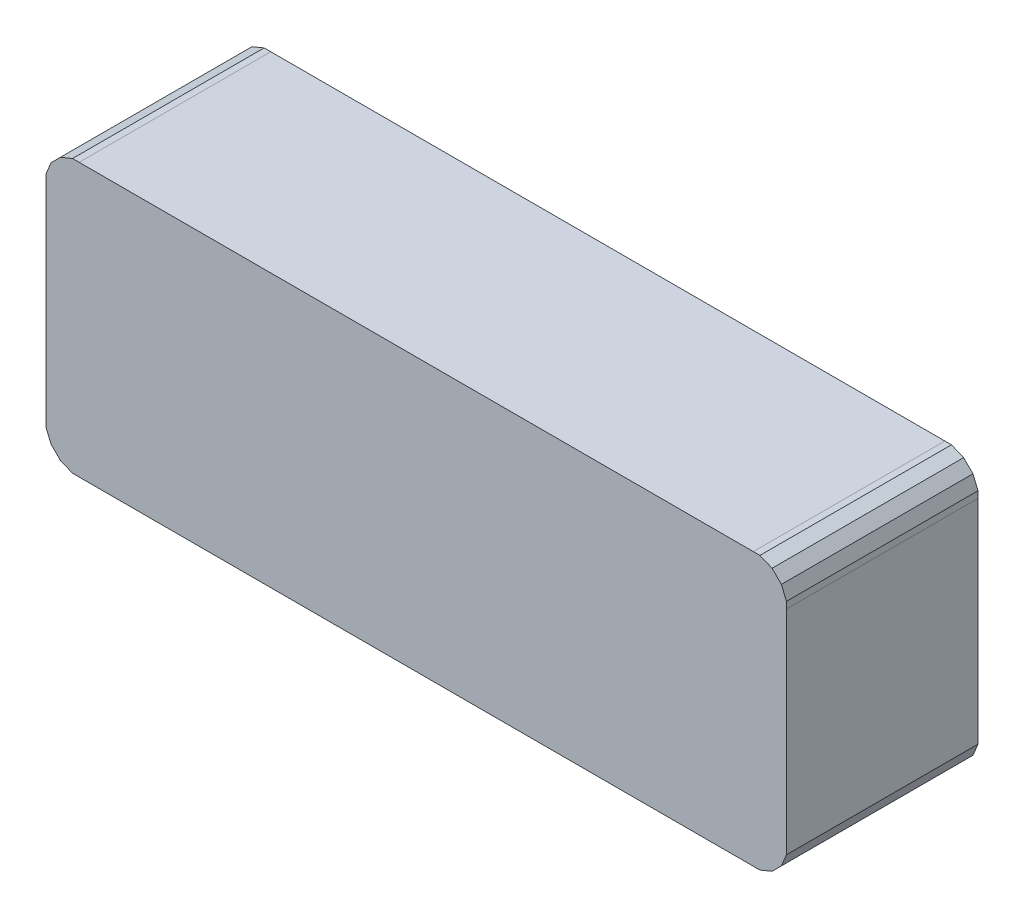
ISO-10303-21;
HEADER;
FILE_DESCRIPTION(('STEP AP214'),'2;1');
FILE_NAME('part.step','',(''),(''),'','','');
FILE_SCHEMA(('AUTOMOTIVE_DESIGN { 1 0 10303 214 1 1 1 1 }'));
ENDSEC;
DATA;
#1=APPLICATION_CONTEXT('core data for automotive mechanical design processes');
#2=APPLICATION_PROTOCOL_DEFINITION('international standard','automotive_design',2000,#1);
#3=PRODUCT_CONTEXT('',#1,'mechanical');
#4=PRODUCT('Part','Part','',(#3));
#5=PRODUCT_RELATED_PRODUCT_CATEGORY('part','',(#4));
#6=PRODUCT_DEFINITION_FORMATION('','',#4);
#7=PRODUCT_DEFINITION_CONTEXT('part definition',#1,'design');
#8=PRODUCT_DEFINITION('design','',#6,#7);
#9=PRODUCT_DEFINITION_SHAPE('','',#8);
#10=(LENGTH_UNIT() NAMED_UNIT(*) SI_UNIT(.MILLI.,.METRE.));
#11=(NAMED_UNIT(*) PLANE_ANGLE_UNIT() SI_UNIT($,.RADIAN.));
#12=(NAMED_UNIT(*) SI_UNIT($,.STERADIAN.) SOLID_ANGLE_UNIT());
#13=UNCERTAINTY_MEASURE_WITH_UNIT(LENGTH_MEASURE(1.E-05),#10,'distance_accuracy_value','');
#14=(GEOMETRIC_REPRESENTATION_CONTEXT(3) GLOBAL_UNCERTAINTY_ASSIGNED_CONTEXT((#13)) GLOBAL_UNIT_ASSIGNED_CONTEXT((#10,
#11,#12)) REPRESENTATION_CONTEXT('',''));
#15=CARTESIAN_POINT('',(0.,0.,0.));
#16=DIRECTION('',(0.,0.,1.));
#17=DIRECTION('',(1.,0.,0.));
#18=AXIS2_PLACEMENT_3D('',#15,#16,#17);
#19=CARTESIAN_POINT('',(4.57546456,1.84928002,2.59999988));
#20=DIRECTION('',(0.,0.,1.));
#21=DIRECTION('',(1.,0.,0.));
#22=AXIS2_PLACEMENT_3D('',#19,#20,#21);
#23=PLANE('',#22);
#24=DIRECTION('',(0.999999998579793,-5.3295537839329E-05,0.));
#25=VECTOR('',#24,1.);
#26=CARTESIAN_POINT('',(-4.57502006,1.8497677,2.59999988));
#27=LINE('',#26,#25);
#28=CARTESIAN_POINT('',(-4.57502006,1.8497677,2.59999988));
#29=VERTEX_POINT('',#28);
#30=CARTESIAN_POINT('',(4.57546456,1.84928002,2.59999988));
#31=VERTEX_POINT('',#30);
#32=EDGE_CURVE('E399',#29,#31,#27,.T.);
#33=ORIENTED_EDGE('',*,*,#32,.F.);
#34=DIRECTION('',(0.999999998389418,-5.67552995264137E-05,0.));
#35=VECTOR('',#34,1.);
#36=CARTESIAN_POINT('',(-4.66452712,1.84977024,2.59999988));
#37=LINE('',#36,#35);
#38=CARTESIAN_POINT('',(-4.66452712,1.84977024,2.59999988));
#39=VERTEX_POINT('',#38);
#40=EDGE_CURVE('E360',#39,#29,#37,.T.);
#41=ORIENTED_EDGE('',*,*,#40,.F.);
#42=DIRECTION('',(0.923890076346643,0.382657976302852,0.));
#43=VECTOR('',#42,1.);
#44=CARTESIAN_POINT('',(-4.82991668,1.78126898,2.59999988));
#45=LINE('',#44,#43);
#46=CARTESIAN_POINT('',(-4.82991668,1.78126898,2.59999988));
#47=VERTEX_POINT('',#46);
#48=EDGE_CURVE('E498',#47,#39,#45,.T.);
#49=ORIENTED_EDGE('',*,*,#48,.F.);
#50=DIRECTION('',(0.707106781186548,0.707106781186548,0.));
#51=VECTOR('',#50,1.);
#52=CARTESIAN_POINT('',(-4.95649758,1.65468808,2.59999988));
#53=LINE('',#52,#51);
#54=CARTESIAN_POINT('',(-4.95649758,1.65468808,2.59999988));
#55=VERTEX_POINT('',#54);
#56=EDGE_CURVE('E390',#55,#47,#53,.T.);
#57=ORIENTED_EDGE('',*,*,#56,.F.);
#58=DIRECTION('',(0.382657976302852,0.923890076346643,0.));
#59=VECTOR('',#58,1.);
#60=CARTESIAN_POINT('',(-5.02499884,1.48929852,2.59999988));
#61=LINE('',#60,#59);
#62=CARTESIAN_POINT('',(-5.02499884,1.48929852,2.59999988));
#63=VERTEX_POINT('',#62);
#64=EDGE_CURVE('E380',#63,#55,#61,.T.);
#65=ORIENTED_EDGE('',*,*,#64,.F.);
#66=DIRECTION('',(-5.67552993676537E-05,0.999999998389418,0.));
#67=VECTOR('',#66,1.);
#68=CARTESIAN_POINT('',(-5.02499376,1.39979146,2.59999988));
#69=LINE('',#68,#67);
#70=CARTESIAN_POINT('',(-5.02499376,1.39979146,2.59999988));
#71=VERTEX_POINT('',#70);
#72=EDGE_CURVE('E545',#71,#63,#69,.T.);
#73=ORIENTED_EDGE('',*,*,#72,.F.);
#74=DIRECTION('',(9.07143019463627E-07,0.999999999999589,0.));
#75=VECTOR('',#74,1.);
#76=CARTESIAN_POINT('',(-5.0249963,-1.40020802,2.59999988));
#77=LINE('',#76,#75);
#78=CARTESIAN_POINT('',(-5.0249963,-1.40020802,2.59999988));
#79=VERTEX_POINT('',#78);
#80=EDGE_CURVE('E309',#79,#71,#77,.T.);
#81=ORIENTED_EDGE('',*,*,#80,.F.);
#82=DIRECTION('',(-0.832050294337998,-0.554700196224998,0.));
#83=VECTOR('',#82,1.);
#84=CARTESIAN_POINT('',(-5.02498106,-1.40019786,2.59999988));
#85=LINE('',#84,#83);
#86=CARTESIAN_POINT('',(-5.02498106,-1.40019786,2.59999988));
#87=VERTEX_POINT('',#86);
#88=EDGE_CURVE('E374',#87,#79,#85,.T.);
#89=ORIENTED_EDGE('',*,*,#88,.F.);
#90=DIRECTION('',(-0.00045426149431171,0.999999896823242,0.));
#91=VECTOR('',#90,1.);
#92=CARTESIAN_POINT('',(-5.02494042,-1.48966174,2.59999988));
#93=LINE('',#92,#91);
#94=CARTESIAN_POINT('',(-5.02494042,-1.48966174,2.59999988));
#95=VERTEX_POINT('',#94);
#96=EDGE_CURVE('E349',#95,#87,#93,.T.);
#97=ORIENTED_EDGE('',*,*,#96,.F.);
#98=DIRECTION('',(-0.38314826593391,0.923686855114783,0.));
#99=VECTOR('',#98,1.);
#100=CARTESIAN_POINT('',(-4.95638582,-1.65493192,2.59999988));
#101=LINE('',#100,#99);
#102=CARTESIAN_POINT('',(-4.95638582,-1.65493192,2.59999988));
#103=VERTEX_POINT('',#102);
#104=EDGE_CURVE('E461',#103,#95,#101,.T.);
#105=ORIENTED_EDGE('',*,*,#104,.F.);
#106=DIRECTION('',(-0.707468684903795,0.706744692148795,0.));
#107=VECTOR('',#106,1.);
#108=CARTESIAN_POINT('',(-4.82980238,-1.78138582,2.59999988));
#109=LINE('',#108,#107);
#110=CARTESIAN_POINT('',(-4.82980238,-1.78138582,2.59999988));
#111=VERTEX_POINT('',#110);
#112=EDGE_CURVE('E304',#111,#103,#109,.T.);
#113=ORIENTED_EDGE('',*,*,#112,.F.);
#114=DIRECTION('',(-0.924083401297023,0.382190878289009,0.));
#115=VECTOR('',#114,1.);
#116=CARTESIAN_POINT('',(-4.66445854,-1.84977024,2.59999988));
#117=LINE('',#116,#115);
#118=CARTESIAN_POINT('',(-4.66445854,-1.84977024,2.59999988));
#119=VERTEX_POINT('',#118);
#120=EDGE_CURVE('E217',#119,#111,#117,.T.);
#121=ORIENTED_EDGE('',*,*,#120,.F.);
#122=DIRECTION('',(-0.999999838777175,-0.0005678429565966,0.));
#123=VECTOR('',#122,1.);
#124=CARTESIAN_POINT('',(-4.5749972,-1.84971944,2.59999988));
#125=LINE('',#124,#123);
#126=CARTESIAN_POINT('',(-4.5749972,-1.84971944,2.59999988));
#127=VERTEX_POINT('',#126);
#128=EDGE_CURVE('E470',#127,#119,#125,.T.);
#129=ORIENTED_EDGE('',*,*,#128,.F.);
#130=DIRECTION('',(-0.999999999999961,2.7758092630919E-07,0.));
#131=VECTOR('',#130,1.);
#132=CARTESIAN_POINT('',(4.57548742,-1.84972198,2.59999988));
#133=LINE('',#132,#131);
#134=CARTESIAN_POINT('',(4.57548742,-1.84972198,2.59999988));
#135=VERTEX_POINT('',#134);
#136=EDGE_CURVE('E538',#135,#127,#133,.T.);
#137=ORIENTED_EDGE('',*,*,#136,.F.);
#138=DIRECTION('',(-0.678280102929852,-0.734803444445839,0.));
#139=VECTOR('',#138,1.);
#140=CARTESIAN_POINT('',(4.5755179,-1.84968896,2.59999988));
#141=LINE('',#140,#139);
#142=CARTESIAN_POINT('',(4.5755179,-1.84968896,2.59999988));
#143=VERTEX_POINT('',#142);
#144=EDGE_CURVE('E316',#143,#135,#141,.T.);
#145=ORIENTED_EDGE('',*,*,#144,.F.);
#146=DIRECTION('',(-0.999999999596462,2.84090908640731E-05,0.));
#147=VECTOR('',#146,1.);
#148=CARTESIAN_POINT('',(4.6649259,-1.8496915,2.59999988));
#149=LINE('',#148,#147);
#150=CARTESIAN_POINT('',(4.6649259,-1.8496915,2.59999988));
#151=VERTEX_POINT('',#150);
#152=EDGE_CURVE('E257',#151,#143,#149,.T.);
#153=ORIENTED_EDGE('',*,*,#152,.F.);
#154=DIRECTION('',(-0.923878851066641,-0.382685077513852,0.));
#155=VECTOR('',#154,1.);
#156=CARTESIAN_POINT('',(4.83013004,-1.78126136,2.59999988));
#157=LINE('',#156,#155);
#158=CARTESIAN_POINT('',(4.83013004,-1.78126136,2.59999988));
#159=VERTEX_POINT('',#158);
#160=EDGE_CURVE('E250',#159,#151,#157,.T.);
#161=ORIENTED_EDGE('',*,*,#160,.F.);
#162=DIRECTION('',(-0.707106781186548,-0.707106781186548,0.));
#163=VECTOR('',#162,1.);
#164=CARTESIAN_POINT('',(4.95657124,-1.65482016,2.59999988));
#165=LINE('',#164,#163);
#166=CARTESIAN_POINT('',(4.95657124,-1.65482016,2.59999988));
#167=VERTEX_POINT('',#166);
#168=EDGE_CURVE('E254',#167,#159,#165,.T.);
#169=ORIENTED_EDGE('',*,*,#168,.F.);
#170=DIRECTION('',(-0.382685077513852,-0.923878851066641,0.));
#171=VECTOR('',#170,1.);
#172=CARTESIAN_POINT('',(5.02500138,-1.48961602,2.59999988));
#173=LINE('',#172,#171);
#174=CARTESIAN_POINT('',(5.02500138,-1.48961602,2.59999988));
#175=VERTEX_POINT('',#174);
#176=EDGE_CURVE('E384',#175,#167,#173,.T.);
#177=ORIENTED_EDGE('',*,*,#176,.F.);
#178=DIRECTION('',(2.84098981223925E-05,-0.999999999596439,0.));
#179=VECTOR('',#178,1.);
#180=CARTESIAN_POINT('',(5.02499884,-1.40021056,2.59999988));
#181=LINE('',#180,#179);
#182=CARTESIAN_POINT('',(5.02499884,-1.40021056,2.59999988));
#183=VERTEX_POINT('',#182);
#184=EDGE_CURVE('E181',#183,#175,#181,.T.);
#185=ORIENTED_EDGE('',*,*,#184,.F.);
#186=DIRECTION('',(-9.07142206706427E-07,-0.999999999999589,0.));
#187=VECTOR('',#186,1.);
#188=CARTESIAN_POINT('',(5.02500138,1.39979146,2.59999988));
#189=LINE('',#188,#187);
#190=CARTESIAN_POINT('',(5.02500138,1.39979146,2.59999988));
#191=VERTEX_POINT('',#190);
#192=EDGE_CURVE('E343',#191,#183,#189,.T.);
#193=ORIENTED_EDGE('',*,*,#192,.F.);
#194=DIRECTION('',(0.164398987156006,-0.986393923857036,0.));
#195=VECTOR('',#194,1.);
#196=CARTESIAN_POINT('',(5.0249963,1.39982194,2.59999988));
#197=LINE('',#196,#195);
#198=CARTESIAN_POINT('',(5.0249963,1.39982194,2.59999988));
#199=VERTEX_POINT('',#198);
#200=EDGE_CURVE('E509',#199,#191,#197,.T.);
#201=ORIENTED_EDGE('',*,*,#200,.F.);
#202=DIRECTION('',(2.8407476961776E-05,-0.999999999596508,0.));
#203=VECTOR('',#202,1.);
#204=CARTESIAN_POINT('',(5.02499376,1.48923502,2.59999988));
#205=LINE('',#204,#203);
#206=CARTESIAN_POINT('',(5.02499376,1.48923502,2.59999988));
#207=VERTEX_POINT('',#206);
#208=EDGE_CURVE('E298',#207,#199,#205,.T.);
#209=ORIENTED_EDGE('',*,*,#208,.F.);
#210=DIRECTION('',(0.382745696709142,-0.923853739317341,0.));
#211=VECTOR('',#210,1.);
#212=CARTESIAN_POINT('',(4.95655092,1.65443916,2.59999988));
#213=LINE('',#212,#211);
#214=CARTESIAN_POINT('',(4.95655092,1.65443916,2.59999988));
#215=VERTEX_POINT('',#214);
#216=EDGE_CURVE('E365',#215,#207,#213,.T.);
#217=ORIENTED_EDGE('',*,*,#216,.F.);
#218=DIRECTION('',(0.707163595164945,-0.707049962642945,0.));
#219=VECTOR('',#218,1.);
#220=CARTESIAN_POINT('',(4.83009448,1.78087528,2.59999988));
#221=LINE('',#220,#219);
#222=CARTESIAN_POINT('',(4.83009448,1.78087528,2.59999988));
#223=VERTEX_POINT('',#222);
#224=EDGE_CURVE('E328',#223,#215,#221,.T.);
#225=ORIENTED_EDGE('',*,*,#224,.F.);
#226=DIRECTION('',(0.923919378216314,-0.38258722215513,0.));
#227=VECTOR('',#226,1.);
#228=CARTESIAN_POINT('',(4.66487764,1.84929018,2.59999988));
#229=LINE('',#228,#227);
#230=CARTESIAN_POINT('',(4.66487764,1.84929018,2.59999988));
#231=VERTEX_POINT('',#230);
#232=EDGE_CURVE('E334',#231,#223,#229,.T.);
#233=ORIENTED_EDGE('',*,*,#232,.F.);
#234=DIRECTION('',(0.999999993544122,0.000113629906682714,0.));
#235=VECTOR('',#234,1.);
#236=CARTESIAN_POINT('',(4.57546456,1.84928002,2.59999988));
#237=LINE('',#236,#235);
#238=EDGE_CURVE('E432',#31,#231,#237,.T.);
#239=ORIENTED_EDGE('',*,*,#238,.F.);
#240=EDGE_LOOP('',(#33,#41,#49,#57,#65,#73,#81,#89,#97,#105,#113,#121,#129,#137,#145,#153,#161,
#169,#177,#185,#193,#201,#209,#217,#225,#233,#239));
#241=FACE_BOUND('',#240,.T.);
#242=ADVANCED_FACE('F17',(#241),#23,.T.);
#243=CARTESIAN_POINT('',(4.57546456,1.84928002,0.));
#244=DIRECTION('',(0.,0.,1.));
#245=DIRECTION('',(1.,0.,0.));
#246=AXIS2_PLACEMENT_3D('',#243,#244,#245);
#247=PLANE('',#246);
#248=DIRECTION('',(0.999999993544122,0.000113629906682714,0.));
#249=VECTOR('',#248,1.);
#250=CARTESIAN_POINT('',(4.57546456,1.84928002,0.));
#251=LINE('',#250,#249);
#252=CARTESIAN_POINT('',(4.57546456,1.84928002,0.));
#253=VERTEX_POINT('',#252);
#254=CARTESIAN_POINT('',(4.66487764,1.84929018,0.));
#255=VERTEX_POINT('',#254);
#256=EDGE_CURVE('E338',#253,#255,#251,.T.);
#257=ORIENTED_EDGE('',*,*,#256,.T.);
#258=DIRECTION('',(0.923919378216314,-0.38258722215513,0.));
#259=VECTOR('',#258,1.);
#260=CARTESIAN_POINT('',(4.66487764,1.84929018,0.));
#261=LINE('',#260,#259);
#262=CARTESIAN_POINT('',(4.83009448,1.78087528,0.));
#263=VERTEX_POINT('',#262);
#264=EDGE_CURVE('E333',#255,#263,#261,.T.);
#265=ORIENTED_EDGE('',*,*,#264,.T.);
#266=DIRECTION('',(0.707163595164945,-0.707049962642945,0.));
#267=VECTOR('',#266,1.);
#268=CARTESIAN_POINT('',(4.83009448,1.78087528,0.));
#269=LINE('',#268,#267);
#270=CARTESIAN_POINT('',(4.95655092,1.65443916,0.));
#271=VERTEX_POINT('',#270);
#272=EDGE_CURVE('E327',#263,#271,#269,.T.);
#273=ORIENTED_EDGE('',*,*,#272,.T.);
#274=DIRECTION('',(0.382745696709142,-0.923853739317341,0.));
#275=VECTOR('',#274,1.);
#276=CARTESIAN_POINT('',(4.95655092,1.65443916,0.));
#277=LINE('',#276,#275);
#278=CARTESIAN_POINT('',(5.02499376,1.48923502,0.));
#279=VERTEX_POINT('',#278);
#280=EDGE_CURVE('E519',#271,#279,#277,.T.);
#281=ORIENTED_EDGE('',*,*,#280,.T.);
#282=DIRECTION('',(2.8407476961776E-05,-0.999999999596508,0.));
#283=VECTOR('',#282,1.);
#284=CARTESIAN_POINT('',(5.02499376,1.48923502,0.));
#285=LINE('',#284,#283);
#286=CARTESIAN_POINT('',(5.0249963,1.39982194,0.));
#287=VERTEX_POINT('',#286);
#288=EDGE_CURVE('E297',#279,#287,#285,.T.);
#289=ORIENTED_EDGE('',*,*,#288,.T.);
#290=DIRECTION('',(0.164398987156006,-0.986393923857036,0.));
#291=VECTOR('',#290,1.);
#292=CARTESIAN_POINT('',(5.0249963,1.39982194,0.));
#293=LINE('',#292,#291);
#294=CARTESIAN_POINT('',(5.02500138,1.39979146,0.));
#295=VERTEX_POINT('',#294);
#296=EDGE_CURVE('E339',#287,#295,#293,.T.);
#297=ORIENTED_EDGE('',*,*,#296,.T.);
#298=DIRECTION('',(-9.07142206706427E-07,-0.999999999999589,0.));
#299=VECTOR('',#298,1.);
#300=CARTESIAN_POINT('',(5.02500138,1.39979146,0.));
#301=LINE('',#300,#299);
#302=CARTESIAN_POINT('',(5.02499884,-1.40021056,0.));
#303=VERTEX_POINT('',#302);
#304=EDGE_CURVE('E510',#295,#303,#301,.T.);
#305=ORIENTED_EDGE('',*,*,#304,.T.);
#306=DIRECTION('',(2.84098981223925E-05,-0.999999999596439,0.));
#307=VECTOR('',#306,1.);
#308=CARTESIAN_POINT('',(5.02499884,-1.40021056,0.));
#309=LINE('',#308,#307);
#310=CARTESIAN_POINT('',(5.02500138,-1.48961602,0.));
#311=VERTEX_POINT('',#310);
#312=EDGE_CURVE('E170',#303,#311,#309,.T.);
#313=ORIENTED_EDGE('',*,*,#312,.T.);
#314=DIRECTION('',(-0.382685077513852,-0.923878851066641,0.));
#315=VECTOR('',#314,1.);
#316=CARTESIAN_POINT('',(5.02500138,-1.48961602,0.));
#317=LINE('',#316,#315);
#318=CARTESIAN_POINT('',(4.95657124,-1.65482016,0.));
#319=VERTEX_POINT('',#318);
#320=EDGE_CURVE('E279',#311,#319,#317,.T.);
#321=ORIENTED_EDGE('',*,*,#320,.T.);
#322=DIRECTION('',(-0.707106781186548,-0.707106781186548,0.));
#323=VECTOR('',#322,1.);
#324=CARTESIAN_POINT('',(4.95657124,-1.65482016,0.));
#325=LINE('',#324,#323);
#326=CARTESIAN_POINT('',(4.83013004,-1.78126136,0.));
#327=VERTEX_POINT('',#326);
#328=EDGE_CURVE('E263',#319,#327,#325,.T.);
#329=ORIENTED_EDGE('',*,*,#328,.T.);
#330=DIRECTION('',(-0.923878851066641,-0.382685077513852,0.));
#331=VECTOR('',#330,1.);
#332=CARTESIAN_POINT('',(4.83013004,-1.78126136,0.));
#333=LINE('',#332,#331);
#334=CARTESIAN_POINT('',(4.6649259,-1.8496915,0.));
#335=VERTEX_POINT('',#334);
#336=EDGE_CURVE('E269',#327,#335,#333,.T.);
#337=ORIENTED_EDGE('',*,*,#336,.T.);
#338=DIRECTION('',(-0.999999999596462,2.84090908640731E-05,0.));
#339=VECTOR('',#338,1.);
#340=CARTESIAN_POINT('',(4.6649259,-1.8496915,0.));
#341=LINE('',#340,#339);
#342=CARTESIAN_POINT('',(4.5755179,-1.84968896,0.));
#343=VERTEX_POINT('',#342);
#344=EDGE_CURVE('E351',#335,#343,#341,.T.);
#345=ORIENTED_EDGE('',*,*,#344,.T.);
#346=DIRECTION('',(-0.678280102929852,-0.734803444445839,0.));
#347=VECTOR('',#346,1.);
#348=CARTESIAN_POINT('',(4.5755179,-1.84968896,0.));
#349=LINE('',#348,#347);
#350=CARTESIAN_POINT('',(4.57548742,-1.84972198,0.));
#351=VERTEX_POINT('',#350);
#352=EDGE_CURVE('E315',#343,#351,#349,.T.);
#353=ORIENTED_EDGE('',*,*,#352,.T.);
#354=DIRECTION('',(-0.999999999999961,2.7758092630919E-07,0.));
#355=VECTOR('',#354,1.);
#356=CARTESIAN_POINT('',(4.57548742,-1.84972198,0.));
#357=LINE('',#356,#355);
#358=CARTESIAN_POINT('',(-4.5749972,-1.84971944,0.));
#359=VERTEX_POINT('',#358);
#360=EDGE_CURVE('E502',#351,#359,#357,.T.);
#361=ORIENTED_EDGE('',*,*,#360,.T.);
#362=DIRECTION('',(-0.999999838777175,-0.0005678429565966,0.));
#363=VECTOR('',#362,1.);
#364=CARTESIAN_POINT('',(-4.5749972,-1.84971944,0.));
#365=LINE('',#364,#363);
#366=CARTESIAN_POINT('',(-4.66445854,-1.84977024,0.));
#367=VERTEX_POINT('',#366);
#368=EDGE_CURVE('E292',#359,#367,#365,.T.);
#369=ORIENTED_EDGE('',*,*,#368,.T.);
#370=DIRECTION('',(-0.924083401297023,0.382190878289009,0.));
#371=VECTOR('',#370,1.);
#372=CARTESIAN_POINT('',(-4.66445854,-1.84977024,0.));
#373=LINE('',#372,#371);
#374=CARTESIAN_POINT('',(-4.82980238,-1.78138582,0.));
#375=VERTEX_POINT('',#374);
#376=EDGE_CURVE('E208',#367,#375,#373,.T.);
#377=ORIENTED_EDGE('',*,*,#376,.T.);
#378=DIRECTION('',(-0.707468684903795,0.706744692148795,0.));
#379=VECTOR('',#378,1.);
#380=CARTESIAN_POINT('',(-4.82980238,-1.78138582,0.));
#381=LINE('',#380,#379);
#382=CARTESIAN_POINT('',(-4.95638582,-1.65493192,0.));
#383=VERTEX_POINT('',#382);
#384=EDGE_CURVE('E303',#375,#383,#381,.T.);
#385=ORIENTED_EDGE('',*,*,#384,.T.);
#386=DIRECTION('',(-0.38314826593391,0.923686855114783,0.));
#387=VECTOR('',#386,1.);
#388=CARTESIAN_POINT('',(-4.95638582,-1.65493192,0.));
#389=LINE('',#388,#387);
#390=CARTESIAN_POINT('',(-5.02494042,-1.48966174,0.));
#391=VERTEX_POINT('',#390);
#392=EDGE_CURVE('E345',#383,#391,#389,.T.);
#393=ORIENTED_EDGE('',*,*,#392,.T.);
#394=DIRECTION('',(-0.00045426149431171,0.999999896823242,0.));
#395=VECTOR('',#394,1.);
#396=CARTESIAN_POINT('',(-5.02494042,-1.48966174,0.));
#397=LINE('',#396,#395);
#398=CARTESIAN_POINT('',(-5.02498106,-1.40019786,0.));
#399=VERTEX_POINT('',#398);
#400=EDGE_CURVE('E370',#391,#399,#397,.T.);
#401=ORIENTED_EDGE('',*,*,#400,.T.);
#402=DIRECTION('',(-0.832050294337998,-0.554700196224998,0.));
#403=VECTOR('',#402,1.);
#404=CARTESIAN_POINT('',(-5.02498106,-1.40019786,0.));
#405=LINE('',#404,#403);
#406=CARTESIAN_POINT('',(-5.0249963,-1.40020802,0.));
#407=VERTEX_POINT('',#406);
#408=EDGE_CURVE('E305',#399,#407,#405,.T.);
#409=ORIENTED_EDGE('',*,*,#408,.T.);
#410=DIRECTION('',(9.07143019463627E-07,0.999999999999589,0.));
#411=VECTOR('',#410,1.);
#412=CARTESIAN_POINT('',(-5.0249963,-1.40020802,0.));
#413=LINE('',#412,#411);
#414=CARTESIAN_POINT('',(-5.02499376,1.39979146,0.));
#415=VERTEX_POINT('',#414);
#416=EDGE_CURVE('E450',#407,#415,#413,.T.);
#417=ORIENTED_EDGE('',*,*,#416,.T.);
#418=DIRECTION('',(-5.67552993676537E-05,0.999999998389418,0.));
#419=VECTOR('',#418,1.);
#420=CARTESIAN_POINT('',(-5.02499376,1.39979146,0.));
#421=LINE('',#420,#419);
#422=CARTESIAN_POINT('',(-5.02499884,1.48929852,0.));
#423=VERTEX_POINT('',#422);
#424=EDGE_CURVE('E376',#415,#423,#421,.T.);
#425=ORIENTED_EDGE('',*,*,#424,.T.);
#426=DIRECTION('',(0.382657976302852,0.923890076346643,0.));
#427=VECTOR('',#426,1.);
#428=CARTESIAN_POINT('',(-5.02499884,1.48929852,0.));
#429=LINE('',#428,#427);
#430=CARTESIAN_POINT('',(-4.95649758,1.65468808,0.));
#431=VERTEX_POINT('',#430);
#432=EDGE_CURVE('E391',#423,#431,#429,.T.);
#433=ORIENTED_EDGE('',*,*,#432,.T.);
#434=DIRECTION('',(0.707106781186548,0.707106781186548,0.));
#435=VECTOR('',#434,1.);
#436=CARTESIAN_POINT('',(-4.95649758,1.65468808,0.));
#437=LINE('',#436,#435);
#438=CARTESIAN_POINT('',(-4.82991668,1.78126898,0.));
#439=VERTEX_POINT('',#438);
#440=EDGE_CURVE('E389',#431,#439,#437,.T.);
#441=ORIENTED_EDGE('',*,*,#440,.T.);
#442=DIRECTION('',(0.923890076346643,0.382657976302852,0.));
#443=VECTOR('',#442,1.);
#444=CARTESIAN_POINT('',(-4.82991668,1.78126898,0.));
#445=LINE('',#444,#443);
#446=CARTESIAN_POINT('',(-4.66452712,1.84977024,0.));
#447=VERTEX_POINT('',#446);
#448=EDGE_CURVE('E356',#439,#447,#445,.T.);
#449=ORIENTED_EDGE('',*,*,#448,.T.);
#450=DIRECTION('',(0.999999998389418,-5.67552995264137E-05,0.));
#451=VECTOR('',#450,1.);
#452=CARTESIAN_POINT('',(-4.66452712,1.84977024,0.));
#453=LINE('',#452,#451);
#454=CARTESIAN_POINT('',(-4.57502006,1.8497677,0.));
#455=VERTEX_POINT('',#454);
#456=EDGE_CURVE('E396',#447,#455,#453,.T.);
#457=ORIENTED_EDGE('',*,*,#456,.T.);
#458=DIRECTION('',(0.999999998579793,-5.3295537839329E-05,0.));
#459=VECTOR('',#458,1.);
#460=CARTESIAN_POINT('',(-4.57502006,1.8497677,0.));
#461=LINE('',#460,#459);
#462=EDGE_CURVE('E30',#455,#253,#461,.T.);
#463=ORIENTED_EDGE('',*,*,#462,.T.);
#464=EDGE_LOOP('',(#257,#265,#273,#281,#289,#297,#305,#313,#321,#329,#337,#345,#353,#361,#369,
#377,#385,#393,#401,#409,#417,#425,#433,#441,#449,#457,#463));
#465=FACE_BOUND('',#464,.T.);
#466=ADVANCED_FACE('F577',(#465),#247,.F.);
#467=CARTESIAN_POINT('',(-4.57502006,1.8497677,0.));
#468=DIRECTION('',(5.3295537839329E-05,0.999999998579793,0.));
#469=DIRECTION('',(0.,0.,-1.));
#470=AXIS2_PLACEMENT_3D('',#467,#468,#469);
#471=PLANE('',#470);
#472=CARTESIAN_POINT('',(-4.57502006000879,1.8497677,0.));
#473=DIRECTION('',(0.,0.,1.));
#474=VECTOR('',#473,1.);
#475=LINE('',#472,#474);
#476=EDGE_CURVE('E11',#455,#29,#475,.T.);
#477=ORIENTED_EDGE('',*,*,#476,.T.);
#478=ORIENTED_EDGE('',*,*,#32,.T.);
#479=DIRECTION('',(0.,0.,1.));
#480=VECTOR('',#479,1.);
#481=CARTESIAN_POINT('',(4.57546456,1.84928002,0.));
#482=LINE('',#481,#480);
#483=EDGE_CURVE('E438',#253,#31,#482,.T.);
#484=ORIENTED_EDGE('',*,*,#483,.F.);
#485=ORIENTED_EDGE('',*,*,#462,.F.);
#486=EDGE_LOOP('',(#477,#478,#484,#485));
#487=FACE_BOUND('',#486,.T.);
#488=ADVANCED_FACE('F19',(#487),#471,.T.);
#489=CARTESIAN_POINT('',(-4.66452712,1.84977024,0.));
#490=DIRECTION('',(5.67552995264137E-05,0.999999998389418,0.));
#491=DIRECTION('',(0.,0.,-1.));
#492=AXIS2_PLACEMENT_3D('',#489,#490,#491);
#493=PLANE('',#492);
#494=ORIENTED_EDGE('',*,*,#476,.F.);
#495=ORIENTED_EDGE('',*,*,#456,.F.);
#496=DIRECTION('',(0.,0.,1.));
#497=VECTOR('',#496,1.);
#498=CARTESIAN_POINT('',(-4.66452712,1.84977024,0.));
#499=LINE('',#498,#497);
#500=EDGE_CURVE('E361',#447,#39,#499,.T.);
#501=ORIENTED_EDGE('',*,*,#500,.T.);
#502=ORIENTED_EDGE('',*,*,#40,.T.);
#503=EDGE_LOOP('',(#494,#495,#501,#502));
#504=FACE_BOUND('',#503,.T.);
#505=ADVANCED_FACE('F427',(#504),#493,.T.);
#506=CARTESIAN_POINT('',(-4.82991668,1.78126898,0.));
#507=DIRECTION('',(-0.382657976302852,0.923890076346643,0.));
#508=DIRECTION('',(0.,0.,1.));
#509=AXIS2_PLACEMENT_3D('',#506,#507,#508);
#510=PLANE('',#509);
#511=DIRECTION('',(0.,0.,1.));
#512=VECTOR('',#511,1.);
#513=CARTESIAN_POINT('',(-4.82991668,1.78126898,0.));
#514=LINE('',#513,#512);
#515=EDGE_CURVE('E385',#439,#47,#514,.T.);
#516=ORIENTED_EDGE('',*,*,#515,.T.);
#517=ORIENTED_EDGE('',*,*,#48,.T.);
#518=ORIENTED_EDGE('',*,*,#500,.F.);
#519=ORIENTED_EDGE('',*,*,#448,.F.);
#520=EDGE_LOOP('',(#516,#517,#518,#519));
#521=FACE_BOUND('',#520,.T.);
#522=ADVANCED_FACE('F663',(#521),#510,.T.);
#523=CARTESIAN_POINT('',(-4.95649758,1.65468808,0.));
#524=DIRECTION('',(-0.707106781186548,0.707106781186548,0.));
#525=DIRECTION('',(0.,0.,1.));
#526=AXIS2_PLACEMENT_3D('',#523,#524,#525);
#527=PLANE('',#526);
#528=DIRECTION('',(0.,0.,1.));
#529=VECTOR('',#528,1.);
#530=CARTESIAN_POINT('',(-4.95649758,1.65468808,0.));
#531=LINE('',#530,#529);
#532=EDGE_CURVE('E395',#431,#55,#531,.T.);
#533=ORIENTED_EDGE('',*,*,#532,.T.);
#534=ORIENTED_EDGE('',*,*,#56,.T.);
#535=ORIENTED_EDGE('',*,*,#515,.F.);
#536=ORIENTED_EDGE('',*,*,#440,.F.);
#537=EDGE_LOOP('',(#533,#534,#535,#536));
#538=FACE_BOUND('',#537,.T.);
#539=ADVANCED_FACE('F703',(#538),#527,.T.);
#540=CARTESIAN_POINT('',(-5.02499884,1.48929852,0.));
#541=DIRECTION('',(-0.923890076346643,0.382657976302852,0.));
#542=DIRECTION('',(0.,0.,1.));
#543=AXIS2_PLACEMENT_3D('',#540,#541,#542);
#544=PLANE('',#543);
#545=DIRECTION('',(0.,0.,1.));
#546=VECTOR('',#545,1.);
#547=CARTESIAN_POINT('',(-5.02499884,1.48929852,0.));
#548=LINE('',#547,#546);
#549=EDGE_CURVE('E381',#423,#63,#548,.T.);
#550=ORIENTED_EDGE('',*,*,#549,.T.);
#551=ORIENTED_EDGE('',*,*,#64,.T.);
#552=ORIENTED_EDGE('',*,*,#532,.F.);
#553=ORIENTED_EDGE('',*,*,#432,.F.);
#554=EDGE_LOOP('',(#550,#551,#552,#553));
#555=FACE_BOUND('',#554,.T.);
#556=ADVANCED_FACE('F676',(#555),#544,.T.);
#557=CARTESIAN_POINT('',(-5.02499376,1.39979146,0.));
#558=DIRECTION('',(-0.999999998389418,-5.67552993676537E-05,0.));
#559=DIRECTION('',(-5.67552993676537E-05,0.999999998389418,0.));
#560=AXIS2_PLACEMENT_3D('',#557,#558,#559);
#561=PLANE('',#560);
#562=DIRECTION('',(0.,0.,1.));
#563=VECTOR('',#562,1.);
#564=CARTESIAN_POINT('',(-5.02499376,1.39979146,0.));
#565=LINE('',#564,#563);
#566=EDGE_CURVE('E494',#415,#71,#565,.T.);
#567=ORIENTED_EDGE('',*,*,#566,.T.);
#568=ORIENTED_EDGE('',*,*,#72,.T.);
#569=ORIENTED_EDGE('',*,*,#549,.F.);
#570=ORIENTED_EDGE('',*,*,#424,.F.);
#571=EDGE_LOOP('',(#567,#568,#569,#570));
#572=FACE_BOUND('',#571,.T.);
#573=ADVANCED_FACE('F673',(#572),#561,.T.);
#574=CARTESIAN_POINT('',(-5.0249963,-1.40020802,0.));
#575=DIRECTION('',(-0.999999999999589,9.07143019463627E-07,0.));
#576=DIRECTION('',(0.,0.,1.));
#577=AXIS2_PLACEMENT_3D('',#574,#575,#576);
#578=PLANE('',#577);
#579=DIRECTION('',(0.,0.,1.));
#580=VECTOR('',#579,1.);
#581=CARTESIAN_POINT('',(-5.0249963,-1.40020802,0.));
#582=LINE('',#581,#580);
#583=EDGE_CURVE('E310',#407,#79,#582,.T.);
#584=ORIENTED_EDGE('',*,*,#583,.T.);
#585=ORIENTED_EDGE('',*,*,#80,.T.);
#586=ORIENTED_EDGE('',*,*,#566,.F.);
#587=ORIENTED_EDGE('',*,*,#416,.F.);
#588=EDGE_LOOP('',(#584,#585,#586,#587));
#589=FACE_BOUND('',#588,.T.);
#590=ADVANCED_FACE('F671',(#589),#578,.T.);
#591=CARTESIAN_POINT('',(-5.02498106,-1.40019786,0.));
#592=DIRECTION('',(0.554700196224998,-0.832050294337998,0.));
#593=DIRECTION('',(0.,0.,-1.));
#594=AXIS2_PLACEMENT_3D('',#591,#592,#593);
#595=PLANE('',#594);
#596=DIRECTION('',(0.,0.,1.));
#597=VECTOR('',#596,1.);
#598=CARTESIAN_POINT('',(-5.02498106,-1.40019786,0.));
#599=LINE('',#598,#597);
#600=EDGE_CURVE('E375',#399,#87,#599,.T.);
#601=ORIENTED_EDGE('',*,*,#600,.T.);
#602=ORIENTED_EDGE('',*,*,#88,.T.);
#603=ORIENTED_EDGE('',*,*,#583,.F.);
#604=ORIENTED_EDGE('',*,*,#408,.F.);
#605=EDGE_LOOP('',(#601,#602,#603,#604));
#606=FACE_BOUND('',#605,.T.);
#607=ADVANCED_FACE('F667',(#606),#595,.T.);
#608=CARTESIAN_POINT('',(-5.02494042,-1.48966174,0.));
#609=DIRECTION('',(-0.999999896823242,-0.00045426149431171,0.));
#610=DIRECTION('',(-0.00045426149431171,0.999999896823242,0.));
#611=AXIS2_PLACEMENT_3D('',#608,#609,#610);
#612=PLANE('',#611);
#613=DIRECTION('',(0.,0.,1.));
#614=VECTOR('',#613,1.);
#615=CARTESIAN_POINT('',(-5.02494042,-1.48966174,0.));
#616=LINE('',#615,#614);
#617=EDGE_CURVE('E350',#391,#95,#616,.T.);
#618=ORIENTED_EDGE('',*,*,#617,.T.);
#619=ORIENTED_EDGE('',*,*,#96,.T.);
#620=ORIENTED_EDGE('',*,*,#600,.F.);
#621=ORIENTED_EDGE('',*,*,#400,.F.);
#622=EDGE_LOOP('',(#618,#619,#620,#621));
#623=FACE_BOUND('',#622,.T.);
#624=ADVANCED_FACE('F670',(#623),#612,.T.);
#625=CARTESIAN_POINT('',(-4.95638582,-1.65493192,0.));
#626=DIRECTION('',(-0.923686855114783,-0.38314826593391,0.));
#627=DIRECTION('',(-0.38314826593391,0.923686855114783,0.));
#628=AXIS2_PLACEMENT_3D('',#625,#626,#627);
#629=PLANE('',#628);
#630=DIRECTION('',(0.,0.,1.));
#631=VECTOR('',#630,1.);
#632=CARTESIAN_POINT('',(-4.95638582,-1.65493192,0.));
#633=LINE('',#632,#631);
#634=EDGE_CURVE('E299',#383,#103,#633,.T.);
#635=ORIENTED_EDGE('',*,*,#634,.T.);
#636=ORIENTED_EDGE('',*,*,#104,.T.);
#637=ORIENTED_EDGE('',*,*,#617,.F.);
#638=ORIENTED_EDGE('',*,*,#392,.F.);
#639=EDGE_LOOP('',(#635,#636,#637,#638));
#640=FACE_BOUND('',#639,.T.);
#641=ADVANCED_FACE('F680',(#640),#629,.T.);
#642=CARTESIAN_POINT('',(-4.82980238,-1.78138582,0.));
#643=DIRECTION('',(-0.706744692148795,-0.707468684903795,0.));
#644=DIRECTION('',(-0.707468684903795,0.706744692148795,0.));
#645=AXIS2_PLACEMENT_3D('',#642,#643,#644);
#646=PLANE('',#645);
#647=DIRECTION('',(0.,0.,1.));
#648=VECTOR('',#647,1.);
#649=CARTESIAN_POINT('',(-4.82980238,-1.78138582,0.));
#650=LINE('',#649,#648);
#651=EDGE_CURVE('E291',#375,#111,#650,.T.);
#652=ORIENTED_EDGE('',*,*,#651,.T.);
#653=ORIENTED_EDGE('',*,*,#112,.T.);
#654=ORIENTED_EDGE('',*,*,#634,.F.);
#655=ORIENTED_EDGE('',*,*,#384,.F.);
#656=EDGE_LOOP('',(#652,#653,#654,#655));
#657=FACE_BOUND('',#656,.T.);
#658=ADVANCED_FACE('F696',(#657),#646,.T.);
#659=CARTESIAN_POINT('',(-4.66445854,-1.84977024,0.));
#660=DIRECTION('',(-0.382190878289009,-0.924083401297023,0.));
#661=DIRECTION('',(-0.924083401297023,0.382190878289009,0.));
#662=AXIS2_PLACEMENT_3D('',#659,#660,#661);
#663=PLANE('',#662);
#664=DIRECTION('',(0.,0.,1.));
#665=VECTOR('',#664,1.);
#666=CARTESIAN_POINT('',(-4.66445854,-1.84977024,0.));
#667=LINE('',#666,#665);
#668=EDGE_CURVE('E364',#367,#119,#667,.T.);
#669=ORIENTED_EDGE('',*,*,#668,.T.);
#670=ORIENTED_EDGE('',*,*,#120,.T.);
#671=ORIENTED_EDGE('',*,*,#651,.F.);
#672=ORIENTED_EDGE('',*,*,#376,.F.);
#673=EDGE_LOOP('',(#669,#670,#671,#672));
#674=FACE_BOUND('',#673,.T.);
#675=ADVANCED_FACE('F692',(#674),#663,.T.);
#676=CARTESIAN_POINT('',(-4.5749972,-1.84971944,0.));
#677=DIRECTION('',(0.0005678429565966,-0.999999838777175,0.));
#678=DIRECTION('',(0.,0.,-1.));
#679=AXIS2_PLACEMENT_3D('',#676,#677,#678);
#680=PLANE('',#679);
#681=DIRECTION('',(0.,0.,1.));
#682=VECTOR('',#681,1.);
#683=CARTESIAN_POINT('',(-4.5749972,-1.84971944,0.));
#684=LINE('',#683,#682);
#685=EDGE_CURVE('E527',#359,#127,#684,.T.);
#686=ORIENTED_EDGE('',*,*,#685,.T.);
#687=ORIENTED_EDGE('',*,*,#128,.T.);
#688=ORIENTED_EDGE('',*,*,#668,.F.);
#689=ORIENTED_EDGE('',*,*,#368,.F.);
#690=EDGE_LOOP('',(#686,#687,#688,#689));
#691=FACE_BOUND('',#690,.T.);
#692=ADVANCED_FACE('F687',(#691),#680,.T.);
#693=CARTESIAN_POINT('',(4.57548742,-1.84972198,0.));
#694=DIRECTION('',(-2.7758092630919E-07,-0.999999999999961,0.));
#695=DIRECTION('',(-0.999999999999961,2.7758092630919E-07,0.));
#696=AXIS2_PLACEMENT_3D('',#693,#694,#695);
#697=PLANE('',#696);
#698=DIRECTION('',(0.,0.,1.));
#699=VECTOR('',#698,1.);
#700=CARTESIAN_POINT('',(4.57548742,-1.84972198,0.));
#701=LINE('',#700,#699);
#702=EDGE_CURVE('E311',#351,#135,#701,.T.);
#703=ORIENTED_EDGE('',*,*,#702,.T.);
#704=ORIENTED_EDGE('',*,*,#136,.T.);
#705=ORIENTED_EDGE('',*,*,#685,.F.);
#706=ORIENTED_EDGE('',*,*,#360,.F.);
#707=EDGE_LOOP('',(#703,#704,#705,#706));
#708=FACE_BOUND('',#707,.T.);
#709=ADVANCED_FACE('F641',(#708),#697,.T.);
#710=CARTESIAN_POINT('',(4.5755179,-1.84968896,0.));
#711=DIRECTION('',(0.734803444445839,-0.678280102929852,0.));
#712=DIRECTION('',(0.,0.,-1.));
#713=AXIS2_PLACEMENT_3D('',#710,#711,#712);
#714=PLANE('',#713);
#715=DIRECTION('',(0.,0.,1.));
#716=VECTOR('',#715,1.);
#717=CARTESIAN_POINT('',(4.5755179,-1.84968896,0.));
#718=LINE('',#717,#716);
#719=EDGE_CURVE('E355',#343,#143,#718,.T.);
#720=ORIENTED_EDGE('',*,*,#719,.T.);
#721=ORIENTED_EDGE('',*,*,#144,.T.);
#722=ORIENTED_EDGE('',*,*,#702,.F.);
#723=ORIENTED_EDGE('',*,*,#352,.F.);
#724=EDGE_LOOP('',(#720,#721,#722,#723));
#725=FACE_BOUND('',#724,.T.);
#726=ADVANCED_FACE('F624',(#725),#714,.T.);
#727=CARTESIAN_POINT('',(4.6649259,-1.8496915,0.));
#728=DIRECTION('',(-2.84090908640731E-05,-0.999999999596462,0.));
#729=DIRECTION('',(-0.999999999596462,2.84090908640731E-05,0.));
#730=AXIS2_PLACEMENT_3D('',#727,#728,#729);
#731=PLANE('',#730);
#732=DIRECTION('',(0.,0.,1.));
#733=VECTOR('',#732,1.);
#734=CARTESIAN_POINT('',(4.6649259,-1.8496915,0.));
#735=LINE('',#734,#733);
#736=EDGE_CURVE('E262',#335,#151,#735,.T.);
#737=ORIENTED_EDGE('',*,*,#736,.T.);
#738=ORIENTED_EDGE('',*,*,#152,.T.);
#739=ORIENTED_EDGE('',*,*,#719,.F.);
#740=ORIENTED_EDGE('',*,*,#344,.F.);
#741=EDGE_LOOP('',(#737,#738,#739,#740));
#742=FACE_BOUND('',#741,.T.);
#743=ADVANCED_FACE('F628',(#742),#731,.T.);
#744=CARTESIAN_POINT('',(4.83013004,-1.78126136,0.));
#745=DIRECTION('',(0.382685077513852,-0.923878851066641,0.));
#746=DIRECTION('',(0.,0.,-1.));
#747=AXIS2_PLACEMENT_3D('',#744,#745,#746);
#748=PLANE('',#747);
#749=DIRECTION('',(0.,0.,1.));
#750=VECTOR('',#749,1.);
#751=CARTESIAN_POINT('',(4.83013004,-1.78126136,0.));
#752=LINE('',#751,#750);
#753=EDGE_CURVE('E266',#327,#159,#752,.T.);
#754=ORIENTED_EDGE('',*,*,#753,.T.);
#755=ORIENTED_EDGE('',*,*,#160,.T.);
#756=ORIENTED_EDGE('',*,*,#736,.F.);
#757=ORIENTED_EDGE('',*,*,#336,.F.);
#758=EDGE_LOOP('',(#754,#755,#756,#757));
#759=FACE_BOUND('',#758,.T.);
#760=ADVANCED_FACE('F267',(#759),#748,.T.);
#761=CARTESIAN_POINT('',(4.95657124,-1.65482016,0.));
#762=DIRECTION('',(0.707106781186548,-0.707106781186548,0.));
#763=DIRECTION('',(0.,0.,-1.));
#764=AXIS2_PLACEMENT_3D('',#761,#762,#763);
#765=PLANE('',#764);
#766=DIRECTION('',(0.,0.,1.));
#767=VECTOR('',#766,1.);
#768=CARTESIAN_POINT('',(4.95657124,-1.65482016,0.));
#769=LINE('',#768,#767);
#770=EDGE_CURVE('E276',#319,#167,#769,.T.);
#771=ORIENTED_EDGE('',*,*,#770,.T.);
#772=ORIENTED_EDGE('',*,*,#168,.T.);
#773=ORIENTED_EDGE('',*,*,#753,.F.);
#774=ORIENTED_EDGE('',*,*,#328,.F.);
#775=EDGE_LOOP('',(#771,#772,#773,#774));
#776=FACE_BOUND('',#775,.T.);
#777=ADVANCED_FACE('F274',(#776),#765,.T.);
#778=CARTESIAN_POINT('',(5.02500138,-1.48961602,0.));
#779=DIRECTION('',(0.923878851066641,-0.382685077513852,0.));
#780=DIRECTION('',(0.,0.,-1.));
#781=AXIS2_PLACEMENT_3D('',#778,#779,#780);
#782=PLANE('',#781);
#783=DIRECTION('',(0.,0.,1.));
#784=VECTOR('',#783,1.);
#785=CARTESIAN_POINT('',(5.02500138,-1.48961602,0.));
#786=LINE('',#785,#784);
#787=EDGE_CURVE('E319',#311,#175,#786,.T.);
#788=ORIENTED_EDGE('',*,*,#787,.T.);
#789=ORIENTED_EDGE('',*,*,#176,.T.);
#790=ORIENTED_EDGE('',*,*,#770,.F.);
#791=ORIENTED_EDGE('',*,*,#320,.F.);
#792=EDGE_LOOP('',(#788,#789,#790,#791));
#793=FACE_BOUND('',#792,.T.);
#794=ADVANCED_FACE('F643',(#793),#782,.T.);
#795=CARTESIAN_POINT('',(5.02500138,1.39979146,0.));
#796=DIRECTION('',(0.999999999999589,-9.07142206706427E-07,0.));
#797=DIRECTION('',(0.,0.,-1.));
#798=AXIS2_PLACEMENT_3D('',#795,#796,#797);
#799=PLANE('',#798);
#800=DIRECTION('',(0.,0.,1.));
#801=VECTOR('',#800,1.);
#802=CARTESIAN_POINT('',(5.02500138,1.39979146,0.));
#803=LINE('',#802,#801);
#804=EDGE_CURVE('E344',#295,#191,#803,.T.);
#805=ORIENTED_EDGE('',*,*,#804,.T.);
#806=ORIENTED_EDGE('',*,*,#192,.T.);
#807=ORIENTED_EDGE('',*,*,#184,.T.);
#808=ORIENTED_EDGE('',*,*,#787,.F.);
#809=ORIENTED_EDGE('',*,*,#312,.F.);
#810=ORIENTED_EDGE('',*,*,#304,.F.);
#811=EDGE_LOOP('',(#805,#806,#807,#808,#809,#810));
#812=FACE_BOUND('',#811,.T.);
#813=ADVANCED_FACE('F593',(#812),#799,.T.);
#814=CARTESIAN_POINT('',(5.0249963,1.39982194,0.));
#815=DIRECTION('',(0.986393923857036,0.164398987156006,0.));
#816=DIRECTION('',(0.,0.,-1.));
#817=AXIS2_PLACEMENT_3D('',#814,#815,#816);
#818=PLANE('',#817);
#819=DIRECTION('',(0.,0.,1.));
#820=VECTOR('',#819,1.);
#821=CARTESIAN_POINT('',(5.0249963,1.39982194,0.));
#822=LINE('',#821,#820);
#823=EDGE_CURVE('E293',#287,#199,#822,.T.);
#824=ORIENTED_EDGE('',*,*,#823,.T.);
#825=ORIENTED_EDGE('',*,*,#200,.T.);
#826=ORIENTED_EDGE('',*,*,#804,.F.);
#827=ORIENTED_EDGE('',*,*,#296,.F.);
#828=EDGE_LOOP('',(#824,#825,#826,#827));
#829=FACE_BOUND('',#828,.T.);
#830=ADVANCED_FACE('F592',(#829),#818,.T.);
#831=CARTESIAN_POINT('',(5.02499376,1.48923502,0.));
#832=DIRECTION('',(0.999999999596508,2.8407476961776E-05,0.));
#833=DIRECTION('',(0.,0.,-1.));
#834=AXIS2_PLACEMENT_3D('',#831,#832,#833);
#835=PLANE('',#834);
#836=DIRECTION('',(0.,0.,1.));
#837=VECTOR('',#836,1.);
#838=CARTESIAN_POINT('',(5.02499376,1.48923502,0.));
#839=LINE('',#838,#837);
#840=EDGE_CURVE('E369',#279,#207,#839,.T.);
#841=ORIENTED_EDGE('',*,*,#840,.T.);
#842=ORIENTED_EDGE('',*,*,#208,.T.);
#843=ORIENTED_EDGE('',*,*,#823,.F.);
#844=ORIENTED_EDGE('',*,*,#288,.F.);
#845=EDGE_LOOP('',(#841,#842,#843,#844));
#846=FACE_BOUND('',#845,.T.);
#847=ADVANCED_FACE('F589',(#846),#835,.T.);
#848=CARTESIAN_POINT('',(4.95655092,1.65443916,0.));
#849=DIRECTION('',(0.923853739317341,0.382745696709142,0.));
#850=DIRECTION('',(0.,0.,-1.));
#851=AXIS2_PLACEMENT_3D('',#848,#849,#850);
#852=PLANE('',#851);
#853=DIRECTION('',(0.,0.,1.));
#854=VECTOR('',#853,1.);
#855=CARTESIAN_POINT('',(4.95655092,1.65443916,0.));
#856=LINE('',#855,#854);
#857=EDGE_CURVE('E323',#271,#215,#856,.T.);
#858=ORIENTED_EDGE('',*,*,#857,.T.);
#859=ORIENTED_EDGE('',*,*,#216,.T.);
#860=ORIENTED_EDGE('',*,*,#840,.F.);
#861=ORIENTED_EDGE('',*,*,#280,.F.);
#862=EDGE_LOOP('',(#858,#859,#860,#861));
#863=FACE_BOUND('',#862,.T.);
#864=ADVANCED_FACE('F583',(#863),#852,.T.);
#865=CARTESIAN_POINT('',(4.83009448,1.78087528,0.));
#866=DIRECTION('',(0.707049962642945,0.707163595164945,0.));
#867=DIRECTION('',(0.,0.,-1.));
#868=AXIS2_PLACEMENT_3D('',#865,#866,#867);
#869=PLANE('',#868);
#870=DIRECTION('',(0.,0.,1.));
#871=VECTOR('',#870,1.);
#872=CARTESIAN_POINT('',(4.83009448,1.78087528,0.));
#873=LINE('',#872,#871);
#874=EDGE_CURVE('E329',#263,#223,#873,.T.);
#875=ORIENTED_EDGE('',*,*,#874,.T.);
#876=ORIENTED_EDGE('',*,*,#224,.T.);
#877=ORIENTED_EDGE('',*,*,#857,.F.);
#878=ORIENTED_EDGE('',*,*,#272,.F.);
#879=EDGE_LOOP('',(#875,#876,#877,#878));
#880=FACE_BOUND('',#879,.T.);
#881=ADVANCED_FACE('F581',(#880),#869,.T.);
#882=CARTESIAN_POINT('',(4.66487764,1.84929018,0.));
#883=DIRECTION('',(0.38258722215513,0.923919378216314,0.));
#884=DIRECTION('',(0.,0.,-1.));
#885=AXIS2_PLACEMENT_3D('',#882,#883,#884);
#886=PLANE('',#885);
#887=DIRECTION('',(0.,0.,1.));
#888=VECTOR('',#887,1.);
#889=CARTESIAN_POINT('',(4.66487764,1.84929018,0.));
#890=LINE('',#889,#888);
#891=EDGE_CURVE('E289',#255,#231,#890,.T.);
#892=ORIENTED_EDGE('',*,*,#891,.T.);
#893=ORIENTED_EDGE('',*,*,#232,.T.);
#894=ORIENTED_EDGE('',*,*,#874,.F.);
#895=ORIENTED_EDGE('',*,*,#264,.F.);
#896=EDGE_LOOP('',(#892,#893,#894,#895));
#897=FACE_BOUND('',#896,.T.);
#898=ADVANCED_FACE('F579',(#897),#886,.T.);
#899=CARTESIAN_POINT('',(4.57546456,1.84928002,0.));
#900=DIRECTION('',(-0.000113629906682714,0.999999993544122,0.));
#901=DIRECTION('',(0.,0.,1.));
#902=AXIS2_PLACEMENT_3D('',#899,#900,#901);
#903=PLANE('',#902);
#904=ORIENTED_EDGE('',*,*,#483,.T.);
#905=ORIENTED_EDGE('',*,*,#238,.T.);
#906=ORIENTED_EDGE('',*,*,#891,.F.);
#907=ORIENTED_EDGE('',*,*,#256,.F.);
#908=EDGE_LOOP('',(#904,#905,#906,#907));
#909=FACE_BOUND('',#908,.T.);
#910=ADVANCED_FACE('F441',(#909),#903,.T.);
#911=CLOSED_SHELL('',(#242,#466,#488,#505,#522,#539,#556,#573,#590,#607,#624,#641,#658,#675,
#692,#709,#726,#743,#760,#777,#794,#813,#830,#847,#864,#881,#898,#910));
#912=MANIFOLD_SOLID_BREP('B1',#911);
#913=ADVANCED_BREP_SHAPE_REPRESENTATION('',(#18,#912),#14);
#914=SHAPE_DEFINITION_REPRESENTATION(#9,#913);
ENDSEC;
END-ISO-10303-21;
